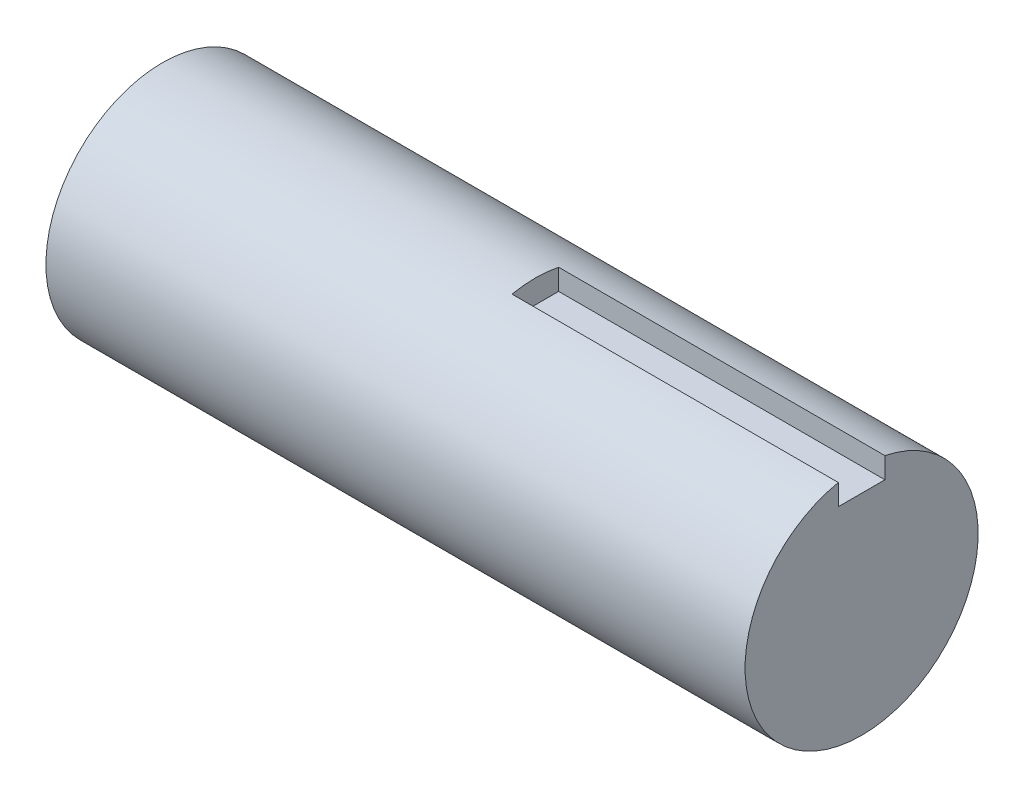
ISO-10303-21;
HEADER;
FILE_DESCRIPTION(('STEP AP214'),'2;1');
FILE_NAME('part.step','',(''),(''),'','','');
FILE_SCHEMA(('AUTOMOTIVE_DESIGN { 1 0 10303 214 1 1 1 1 }'));
ENDSEC;
DATA;
#1=APPLICATION_CONTEXT('core data for automotive mechanical design processes');
#2=APPLICATION_PROTOCOL_DEFINITION('international standard','automotive_design',2000,#1);
#3=PRODUCT_CONTEXT('',#1,'mechanical');
#4=PRODUCT('Part','Part','',(#3));
#5=PRODUCT_RELATED_PRODUCT_CATEGORY('part','',(#4));
#6=PRODUCT_DEFINITION_FORMATION('','',#4);
#7=PRODUCT_DEFINITION_CONTEXT('part definition',#1,'design');
#8=PRODUCT_DEFINITION('design','',#6,#7);
#9=PRODUCT_DEFINITION_SHAPE('','',#8);
#10=(LENGTH_UNIT() NAMED_UNIT(*) SI_UNIT(.MILLI.,.METRE.));
#11=(NAMED_UNIT(*) PLANE_ANGLE_UNIT() SI_UNIT($,.RADIAN.));
#12=(NAMED_UNIT(*) SI_UNIT($,.STERADIAN.) SOLID_ANGLE_UNIT());
#13=UNCERTAINTY_MEASURE_WITH_UNIT(LENGTH_MEASURE(1.E-05),#10,'distance_accuracy_value','');
#14=(GEOMETRIC_REPRESENTATION_CONTEXT(3) GLOBAL_UNCERTAINTY_ASSIGNED_CONTEXT((#13)) GLOBAL_UNIT_ASSIGNED_CONTEXT((#10,
#11,#12)) REPRESENTATION_CONTEXT('',''));
#15=CARTESIAN_POINT('',(0.,0.,0.));
#16=DIRECTION('',(0.,0.,1.));
#17=DIRECTION('',(1.,0.,0.));
#18=AXIS2_PLACEMENT_3D('',#15,#16,#17);
#19=CARTESIAN_POINT('',(150.,0.,0.));
#20=DIRECTION('',(-1.,0.,0.));
#21=DIRECTION('',(0.,0.,1.));
#22=AXIS2_PLACEMENT_3D('',#19,#20,#21);
#23=CYLINDRICAL_SURFACE('',#22,25.);
#24=CARTESIAN_POINT('',(80.,0.,0.));
#25=DIRECTION('',(1.,0.,0.));
#26=DIRECTION('',(0.,0.,-1.));
#27=AXIS2_PLACEMENT_3D('',#24,#25,#26);
#28=CIRCLE('',#27,25.);
#29=CARTESIAN_POINT('',(80.,24.4948974278318,-5.));
#30=VERTEX_POINT('',#29);
#31=CARTESIAN_POINT('',(80.,24.4948974278318,5.));
#32=VERTEX_POINT('',#31);
#33=EDGE_CURVE('E11',#30,#32,#28,.T.);
#34=ORIENTED_EDGE('',*,*,#33,.F.);
#35=DIRECTION('',(-1.,0.,0.));
#36=VECTOR('',#35,1.);
#37=CARTESIAN_POINT('',(150.,24.4948974278318,-5.));
#38=LINE('',#37,#36);
#39=CARTESIAN_POINT('',(150.,24.4948974278318,-5.));
#40=VERTEX_POINT('',#39);
#41=EDGE_CURVE('E68',#30,#40,#38,.F.);
#42=ORIENTED_EDGE('',*,*,#41,.T.);
#43=CARTESIAN_POINT('',(150.,0.,0.));
#44=DIRECTION('',(1.,0.,0.));
#45=DIRECTION('',(0.,0.,-1.));
#46=AXIS2_PLACEMENT_3D('',#43,#44,#45);
#47=CIRCLE('',#46,25.);
#48=CARTESIAN_POINT('',(150.,24.4948974278318,5.));
#49=VERTEX_POINT('',#48);
#50=EDGE_CURVE('E122',#49,#40,#47,.T.);
#51=ORIENTED_EDGE('',*,*,#50,.F.);
#52=DIRECTION('',(-1.,0.,0.));
#53=VECTOR('',#52,1.);
#54=CARTESIAN_POINT('',(150.,24.4948974278318,5.));
#55=LINE('',#54,#53);
#56=EDGE_CURVE('E60',#49,#32,#55,.T.);
#57=ORIENTED_EDGE('',*,*,#56,.T.);
#58=EDGE_LOOP('',(#34,#42,#51,#57));
#59=FACE_BOUND('',#58,.T.);
#60=CARTESIAN_POINT('',(0.,0.,0.));
#61=DIRECTION('',(1.,0.,0.));
#62=DIRECTION('',(0.,0.,-1.));
#63=AXIS2_PLACEMENT_3D('',#60,#61,#62);
#64=CIRCLE('',#63,25.);
#65=CARTESIAN_POINT('',(0.,0.,-25.));
#66=VERTEX_POINT('',#65);
#67=EDGE_CURVE('E121',#66,#66,#64,.T.);
#68=ORIENTED_EDGE('',*,*,#67,.T.);
#69=EDGE_LOOP('',(#68));
#70=FACE_BOUND('',#69,.T.);
#71=ADVANCED_FACE('F45',(#59,#70),#23,.T.);
#72=CARTESIAN_POINT('',(150.,0.,0.));
#73=DIRECTION('',(1.,0.,0.));
#74=DIRECTION('',(0.,0.,-1.));
#75=AXIS2_PLACEMENT_3D('',#72,#73,#74);
#76=PLANE('',#75);
#77=DIRECTION('',(0.,1.,0.));
#78=VECTOR('',#77,1.);
#79=CARTESIAN_POINT('',(150.,30.,-5.));
#80=LINE('',#79,#78);
#81=CARTESIAN_POINT('',(150.,20.,-5.));
#82=VERTEX_POINT('',#81);
#83=EDGE_CURVE('E109',#82,#40,#80,.T.);
#84=ORIENTED_EDGE('',*,*,#83,.F.);
#85=DIRECTION('',(0.,0.,-1.));
#86=VECTOR('',#85,1.);
#87=CARTESIAN_POINT('',(150.,20.,5.));
#88=LINE('',#87,#86);
#89=CARTESIAN_POINT('',(150.,20.,5.));
#90=VERTEX_POINT('',#89);
#91=EDGE_CURVE('E112',#90,#82,#88,.T.);
#92=ORIENTED_EDGE('',*,*,#91,.F.);
#93=DIRECTION('',(0.,-1.,0.));
#94=VECTOR('',#93,1.);
#95=CARTESIAN_POINT('',(150.,0.,5.));
#96=LINE('',#95,#94);
#97=EDGE_CURVE('E53',#49,#90,#96,.T.);
#98=ORIENTED_EDGE('',*,*,#97,.F.);
#99=ORIENTED_EDGE('',*,*,#50,.T.);
#100=EDGE_LOOP('',(#84,#92,#98,#99));
#101=FACE_BOUND('',#100,.T.);
#102=ADVANCED_FACE('F134',(#101),#76,.T.);
#103=CARTESIAN_POINT('',(0.,0.,0.));
#104=DIRECTION('',(1.,0.,0.));
#105=DIRECTION('',(0.,0.,-1.));
#106=AXIS2_PLACEMENT_3D('',#103,#104,#105);
#107=PLANE('',#106);
#108=ORIENTED_EDGE('',*,*,#67,.F.);
#109=EDGE_LOOP('',(#108));
#110=FACE_BOUND('',#109,.T.);
#111=ADVANCED_FACE('F132',(#110),#107,.F.);
#112=CARTESIAN_POINT('',(80.,0.,0.));
#113=DIRECTION('',(1.,0.,0.));
#114=DIRECTION('',(0.,0.,-1.));
#115=AXIS2_PLACEMENT_3D('',#112,#113,#114);
#116=PLANE('',#115);
#117=ORIENTED_EDGE('',*,*,#33,.T.);
#118=DIRECTION('',(0.,-1.,0.));
#119=VECTOR('',#118,1.);
#120=CARTESIAN_POINT('',(80.,30.,5.));
#121=LINE('',#120,#119);
#122=CARTESIAN_POINT('',(80.,20.,5.));
#123=VERTEX_POINT('',#122);
#124=EDGE_CURVE('E86',#32,#123,#121,.T.);
#125=ORIENTED_EDGE('',*,*,#124,.T.);
#126=DIRECTION('',(0.,0.,-1.));
#127=VECTOR('',#126,1.);
#128=CARTESIAN_POINT('',(80.,20.,5.));
#129=LINE('',#128,#127);
#130=CARTESIAN_POINT('',(80.,20.,-5.));
#131=VERTEX_POINT('',#130);
#132=EDGE_CURVE('E90',#123,#131,#129,.T.);
#133=ORIENTED_EDGE('',*,*,#132,.T.);
#134=DIRECTION('',(0.,1.,0.));
#135=VECTOR('',#134,1.);
#136=CARTESIAN_POINT('',(80.,30.,-5.));
#137=LINE('',#136,#135);
#138=EDGE_CURVE('E93',#131,#30,#137,.T.);
#139=ORIENTED_EDGE('',*,*,#138,.T.);
#140=EDGE_LOOP('',(#117,#125,#133,#139));
#141=FACE_BOUND('',#140,.T.);
#142=ADVANCED_FACE('F88',(#141),#116,.T.);
#143=CARTESIAN_POINT('',(80.,30.,-5.));
#144=DIRECTION('',(0.,0.,-1.));
#145=DIRECTION('',(-1.,0.,0.));
#146=AXIS2_PLACEMENT_3D('',#143,#144,#145);
#147=PLANE('',#146);
#148=ORIENTED_EDGE('',*,*,#138,.F.);
#149=DIRECTION('',(1.,0.,0.));
#150=VECTOR('',#149,1.);
#151=CARTESIAN_POINT('',(80.,20.,-5.));
#152=LINE('',#151,#150);
#153=EDGE_CURVE('E102',#131,#82,#152,.T.);
#154=ORIENTED_EDGE('',*,*,#153,.T.);
#155=ORIENTED_EDGE('',*,*,#83,.T.);
#156=ORIENTED_EDGE('',*,*,#41,.F.);
#157=EDGE_LOOP('',(#148,#154,#155,#156));
#158=FACE_BOUND('',#157,.T.);
#159=ADVANCED_FACE('F139',(#158),#147,.F.);
#160=CARTESIAN_POINT('',(80.,30.,5.));
#161=DIRECTION('',(0.,0.,1.));
#162=DIRECTION('',(1.,0.,0.));
#163=AXIS2_PLACEMENT_3D('',#160,#161,#162);
#164=PLANE('',#163);
#165=ORIENTED_EDGE('',*,*,#97,.T.);
#166=DIRECTION('',(1.,0.,0.));
#167=VECTOR('',#166,1.);
#168=CARTESIAN_POINT('',(80.,20.,5.));
#169=LINE('',#168,#167);
#170=EDGE_CURVE('E96',#123,#90,#169,.T.);
#171=ORIENTED_EDGE('',*,*,#170,.F.);
#172=ORIENTED_EDGE('',*,*,#124,.F.);
#173=ORIENTED_EDGE('',*,*,#56,.F.);
#174=EDGE_LOOP('',(#165,#171,#172,#173));
#175=FACE_BOUND('',#174,.T.);
#176=ADVANCED_FACE('F97',(#175),#164,.F.);
#177=CARTESIAN_POINT('',(80.,20.,5.));
#178=DIRECTION('',(0.,-1.,0.));
#179=DIRECTION('',(0.,0.,-1.));
#180=AXIS2_PLACEMENT_3D('',#177,#178,#179);
#181=PLANE('',#180);
#182=ORIENTED_EDGE('',*,*,#91,.T.);
#183=ORIENTED_EDGE('',*,*,#153,.F.);
#184=ORIENTED_EDGE('',*,*,#132,.F.);
#185=ORIENTED_EDGE('',*,*,#170,.T.);
#186=EDGE_LOOP('',(#182,#183,#184,#185));
#187=FACE_BOUND('',#186,.T.);
#188=ADVANCED_FACE('F104',(#187),#181,.F.);
#189=CLOSED_SHELL('',(#71,#102,#111,#142,#159,#176,#188));
#190=MANIFOLD_SOLID_BREP('B2',#189);
#191=ADVANCED_BREP_SHAPE_REPRESENTATION('',(#18,#190),#14);
#192=SHAPE_DEFINITION_REPRESENTATION(#9,#191);
ENDSEC;
END-ISO-10303-21;
